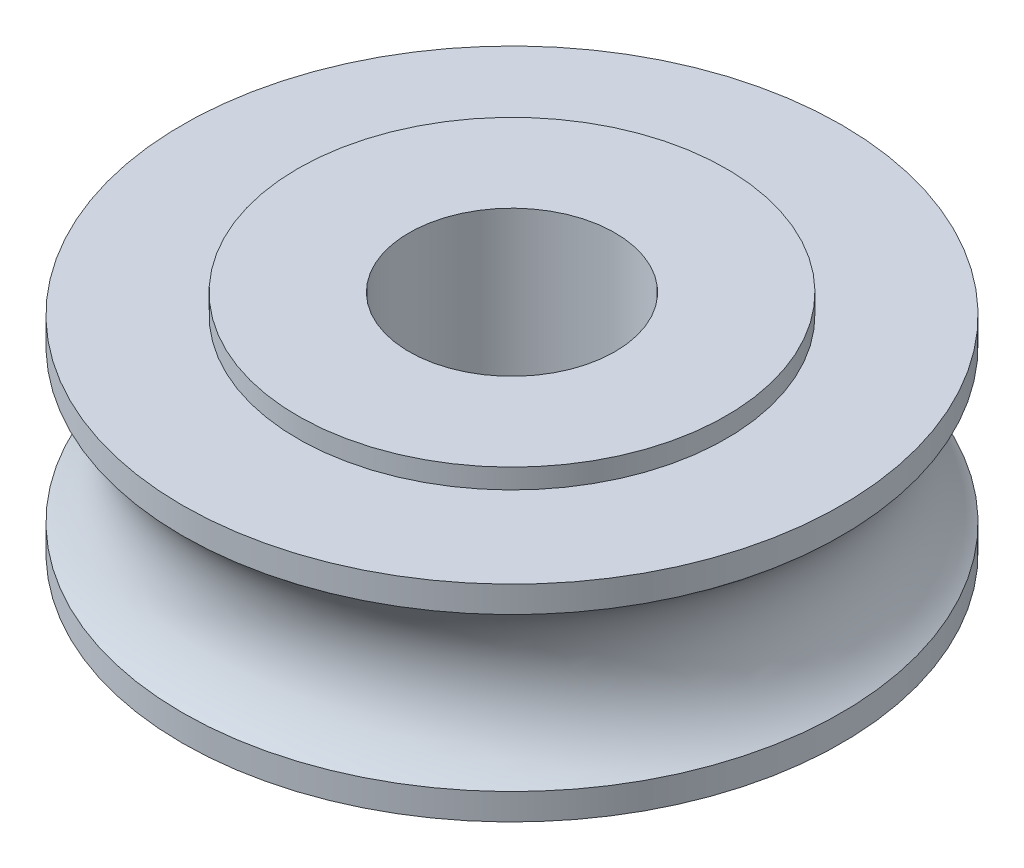
ISO-10303-21;
HEADER;
FILE_DESCRIPTION(('STEP AP214'),'2;1');
FILE_NAME('part.step','',(''),(''),'','','');
FILE_SCHEMA(('AUTOMOTIVE_DESIGN { 1 0 10303 214 1 1 1 1 }'));
ENDSEC;
DATA;
#1=APPLICATION_CONTEXT('core data for automotive mechanical design processes');
#2=APPLICATION_PROTOCOL_DEFINITION('international standard','automotive_design',2000,#1);
#3=PRODUCT_CONTEXT('',#1,'mechanical');
#4=PRODUCT('Part','Part','',(#3));
#5=PRODUCT_RELATED_PRODUCT_CATEGORY('part','',(#4));
#6=PRODUCT_DEFINITION_FORMATION('','',#4);
#7=PRODUCT_DEFINITION_CONTEXT('part definition',#1,'design');
#8=PRODUCT_DEFINITION('design','',#6,#7);
#9=PRODUCT_DEFINITION_SHAPE('','',#8);
#10=(LENGTH_UNIT() NAMED_UNIT(*) SI_UNIT(.MILLI.,.METRE.));
#11=(NAMED_UNIT(*) PLANE_ANGLE_UNIT() SI_UNIT($,.RADIAN.));
#12=(NAMED_UNIT(*) SI_UNIT($,.STERADIAN.) SOLID_ANGLE_UNIT());
#13=UNCERTAINTY_MEASURE_WITH_UNIT(LENGTH_MEASURE(1.E-05),#10,'distance_accuracy_value','');
#14=(GEOMETRIC_REPRESENTATION_CONTEXT(3) GLOBAL_UNCERTAINTY_ASSIGNED_CONTEXT((#13)) GLOBAL_UNIT_ASSIGNED_CONTEXT((#10,
#11,#12)) REPRESENTATION_CONTEXT('',''));
#15=CARTESIAN_POINT('',(0.,0.,0.));
#16=DIRECTION('',(0.,0.,1.));
#17=DIRECTION('',(1.,0.,0.));
#18=AXIS2_PLACEMENT_3D('',#15,#16,#17);
#19=CARTESIAN_POINT('',(0.,7.9375,0.));
#20=DIRECTION('',(0.,1.,0.));
#21=DIRECTION('',(0.,0.,1.));
#22=AXIS2_PLACEMENT_3D('',#19,#20,#21);
#23=PLANE('',#22);
#24=CARTESIAN_POINT('',(0.,7.9375,0.));
#25=DIRECTION('',(0.,1.,0.));
#26=DIRECTION('',(0.,0.,1.));
#27=AXIS2_PLACEMENT_3D('',#24,#25,#26);
#28=CIRCLE('',#27,12.7);
#29=CARTESIAN_POINT('',(0.,7.9375,12.7));
#30=VERTEX_POINT('',#29);
#31=EDGE_CURVE('E38',#30,#30,#28,.T.);
#32=ORIENTED_EDGE('',*,*,#31,.T.);
#33=EDGE_LOOP('',(#32));
#34=FACE_BOUND('',#33,.T.);
#35=CARTESIAN_POINT('',(0.,7.9375,0.));
#36=DIRECTION('',(0.,1.,0.));
#37=DIRECTION('',(0.,0.,1.));
#38=AXIS2_PLACEMENT_3D('',#35,#36,#37);
#39=CIRCLE('',#38,8.255);
#40=CARTESIAN_POINT('',(-8.25499999999994,7.9375,0.));
#41=VERTEX_POINT('',#40);
#42=EDGE_CURVE('E54',#41,#41,#39,.F.);
#43=ORIENTED_EDGE('',*,*,#42,.T.);
#44=EDGE_LOOP('',(#43));
#45=FACE_BOUND('',#44,.T.);
#46=ADVANCED_FACE('F31',(#34,#45),#23,.T.);
#47=CARTESIAN_POINT('',(0.,0.,0.));
#48=DIRECTION('',(0.,1.,0.));
#49=DIRECTION('',(0.,0.,1.));
#50=AXIS2_PLACEMENT_3D('',#47,#48,#49);
#51=PLANE('',#50);
#52=CARTESIAN_POINT('',(0.,0.,0.));
#53=DIRECTION('',(0.,1.,0.));
#54=DIRECTION('',(0.,0.,1.));
#55=AXIS2_PLACEMENT_3D('',#52,#53,#54);
#56=CIRCLE('',#55,12.7);
#57=CARTESIAN_POINT('',(0.,0.,12.7));
#58=VERTEX_POINT('',#57);
#59=EDGE_CURVE('E42',#58,#58,#56,.T.);
#60=ORIENTED_EDGE('',*,*,#59,.F.);
#61=EDGE_LOOP('',(#60));
#62=FACE_BOUND('',#61,.T.);
#63=CARTESIAN_POINT('',(0.,0.,0.));
#64=DIRECTION('',(0.,1.,0.));
#65=DIRECTION('',(0.,0.,1.));
#66=AXIS2_PLACEMENT_3D('',#63,#64,#65);
#67=CIRCLE('',#66,8.255);
#68=CARTESIAN_POINT('',(-8.255,0.,0.));
#69=VERTEX_POINT('',#68);
#70=EDGE_CURVE('E10',#69,#69,#67,.F.);
#71=ORIENTED_EDGE('',*,*,#70,.F.);
#72=EDGE_LOOP('',(#71));
#73=FACE_BOUND('',#72,.T.);
#74=ADVANCED_FACE('F90',(#62,#73),#51,.F.);
#75=CARTESIAN_POINT('',(0.,7.9375,0.));
#76=DIRECTION('',(0.,-1.,0.));
#77=DIRECTION('',(0.,0.,-1.));
#78=AXIS2_PLACEMENT_3D('',#75,#76,#77);
#79=CYLINDRICAL_SURFACE('',#78,12.7);
#80=CARTESIAN_POINT('',(0.,6.9215,0.));
#81=DIRECTION('',(0.,1.,0.));
#82=DIRECTION('',(0.,0.,1.));
#83=AXIS2_PLACEMENT_3D('',#80,#81,#82);
#84=CIRCLE('',#83,12.7);
#85=CARTESIAN_POINT('',(0.,6.9215,12.7));
#86=VERTEX_POINT('',#85);
#87=EDGE_CURVE('E51',#86,#86,#84,.T.);
#88=ORIENTED_EDGE('',*,*,#87,.T.);
#89=EDGE_LOOP('',(#88));
#90=FACE_BOUND('',#89,.T.);
#91=ORIENTED_EDGE('',*,*,#31,.F.);
#92=EDGE_LOOP('',(#91));
#93=FACE_BOUND('',#92,.T.);
#94=ADVANCED_FACE('F96',(#90,#93),#79,.T.);
#95=CARTESIAN_POINT('',(0.,1.016,0.));
#96=DIRECTION('',(0.,1.,0.));
#97=DIRECTION('',(0.,0.,1.));
#98=AXIS2_PLACEMENT_3D('',#95,#96,#97);
#99=CIRCLE('',#98,12.7);
#100=CARTESIAN_POINT('',(0.,1.016,12.7));
#101=VERTEX_POINT('',#100);
#102=EDGE_CURVE('E47',#101,#101,#99,.T.);
#103=ORIENTED_EDGE('',*,*,#102,.F.);
#104=EDGE_LOOP('',(#103));
#105=FACE_BOUND('',#104,.T.);
#106=ORIENTED_EDGE('',*,*,#59,.T.);
#107=EDGE_LOOP('',(#106));
#108=FACE_BOUND('',#107,.T.);
#109=ADVANCED_FACE('F33',(#105,#108),#79,.T.);
#110=CARTESIAN_POINT('',(0.,3.96875,0.));
#111=DIRECTION('',(0.,1.,0.));
#112=DIRECTION('',(0.,0.,1.));
#113=AXIS2_PLACEMENT_3D('',#110,#111,#112);
#114=TOROIDAL_SURFACE('',#113,14.9225136853448,3.69571368534483);
#115=ORIENTED_EDGE('',*,*,#87,.F.);
#116=EDGE_LOOP('',(#115));
#117=FACE_BOUND('',#116,.T.);
#118=ORIENTED_EDGE('',*,*,#102,.T.);
#119=EDGE_LOOP('',(#118));
#120=FACE_BOUND('',#119,.T.);
#121=ADVANCED_FACE('F84',(#117,#120),#114,.F.);
#122=CARTESIAN_POINT('',(0.,-0.825500000000002,0.));
#123=DIRECTION('',(0.,1.,0.));
#124=DIRECTION('',(-1.,0.,0.));
#125=AXIS2_PLACEMENT_3D('',#122,#123,#124);
#126=CYLINDRICAL_SURFACE('',#125,8.255);
#127=CARTESIAN_POINT('',(0.,-0.825500000000002,0.));
#128=DIRECTION('',(0.,-1.,0.));
#129=DIRECTION('',(1.,0.,0.));
#130=AXIS2_PLACEMENT_3D('',#127,#128,#129);
#131=CIRCLE('',#130,8.255);
#132=CARTESIAN_POINT('',(-8.25500000000001,-0.825499999999944,0.));
#133=VERTEX_POINT('',#132);
#134=EDGE_CURVE('E57',#133,#133,#131,.T.);
#135=CARTESIAN_POINT('',(-8.25500000000001,-0.825499999999944,0.));
#136=CARTESIAN_POINT('',(-8.25500000000001,-0.816901041666611,0.));
#137=CARTESIAN_POINT('',(-8.25500000000001,-0.808302083333279,0.));
#138=CARTESIAN_POINT('',(-8.25500000000001,-0.791104166666613,0.));
#139=CARTESIAN_POINT('',(-8.25500000000001,-0.78250520833328,0.));
#140=CARTESIAN_POINT('',(-8.25500000000001,-0.765307291666615,0.));
#141=CARTESIAN_POINT('',(-8.25500000000001,-0.756708333333282,0.));
#142=CARTESIAN_POINT('',(-8.25500000000001,-0.739510416666616,0.));
#143=CARTESIAN_POINT('',(-8.25500000000001,-0.730911458333284,0.));
#144=CARTESIAN_POINT('',(-8.25500000000001,-0.713713541666618,0.));
#145=CARTESIAN_POINT('',(-8.255,-0.705114583333285,0.));
#146=CARTESIAN_POINT('',(-8.255,-0.68791666666662,0.));
#147=CARTESIAN_POINT('',(-8.255,-0.679317708333287,0.));
#148=CARTESIAN_POINT('',(-8.255,-0.662119791666622,0.));
#149=CARTESIAN_POINT('',(-8.255,-0.653520833333289,0.));
#150=CARTESIAN_POINT('',(-8.255,-0.636322916666624,0.));
#151=CARTESIAN_POINT('',(-8.255,-0.627723958333291,0.));
#152=CARTESIAN_POINT('',(-8.255,-0.610526041666625,0.));
#153=CARTESIAN_POINT('',(-8.255,-0.601927083333293,0.));
#154=CARTESIAN_POINT('',(-8.255,-0.584729166666627,0.));
#155=CARTESIAN_POINT('',(-8.255,-0.576130208333294,0.));
#156=CARTESIAN_POINT('',(-8.255,-0.558932291666629,0.));
#157=CARTESIAN_POINT('',(-8.255,-0.550333333333296,0.));
#158=CARTESIAN_POINT('',(-8.255,-0.53313541666663,0.));
#159=CARTESIAN_POINT('',(-8.255,-0.524536458333298,0.));
#160=CARTESIAN_POINT('',(-8.255,-0.507338541666632,0.));
#161=CARTESIAN_POINT('',(-8.255,-0.4987395833333,0.));
#162=CARTESIAN_POINT('',(-8.255,-0.481541666666634,0.));
#163=CARTESIAN_POINT('',(-8.255,-0.472942708333301,0.));
#164=CARTESIAN_POINT('',(-8.255,-0.455744791666636,0.));
#165=CARTESIAN_POINT('',(-8.255,-0.447145833333303,0.));
#166=CARTESIAN_POINT('',(-8.255,-0.429947916666638,0.));
#167=CARTESIAN_POINT('',(-8.255,-0.421348958333305,0.));
#168=CARTESIAN_POINT('',(-8.255,-0.404151041666639,0.));
#169=CARTESIAN_POINT('',(-8.255,-0.395552083333306,0.));
#170=CARTESIAN_POINT('',(-8.255,-0.378354166666641,0.));
#171=CARTESIAN_POINT('',(-8.255,-0.369755208333308,0.));
#172=CARTESIAN_POINT('',(-8.255,-0.352557291666643,0.));
#173=CARTESIAN_POINT('',(-8.255,-0.34395833333331,0.));
#174=CARTESIAN_POINT('',(-8.255,-0.326760416666645,0.));
#175=CARTESIAN_POINT('',(-8.255,-0.318161458333312,0.));
#176=CARTESIAN_POINT('',(-8.255,-0.300963541666646,0.));
#177=CARTESIAN_POINT('',(-8.255,-0.292364583333314,0.));
#178=CARTESIAN_POINT('',(-8.255,-0.275166666666648,0.));
#179=CARTESIAN_POINT('',(-8.255,-0.266567708333315,0.));
#180=CARTESIAN_POINT('',(-8.255,-0.24936979166665,0.));
#181=CARTESIAN_POINT('',(-8.255,-0.240770833333317,0.));
#182=CARTESIAN_POINT('',(-8.255,-0.223572916666652,0.));
#183=CARTESIAN_POINT('',(-8.255,-0.214973958333319,0.));
#184=CARTESIAN_POINT('',(-8.255,-0.197776041666653,0.));
#185=CARTESIAN_POINT('',(-8.255,-0.189177083333321,0.));
#186=CARTESIAN_POINT('',(-8.255,-0.171979166666655,0.));
#187=CARTESIAN_POINT('',(-8.255,-0.163380208333322,0.));
#188=CARTESIAN_POINT('',(-8.255,-0.146182291666657,0.));
#189=CARTESIAN_POINT('',(-8.255,-0.137583333333324,0.));
#190=CARTESIAN_POINT('',(-8.255,-0.120385416666659,0.));
#191=CARTESIAN_POINT('',(-8.255,-0.111786458333326,0.));
#192=CARTESIAN_POINT('',(-8.255,-0.0945885416666604,0.));
#193=CARTESIAN_POINT('',(-8.255,-0.0859895833333276,0.));
#194=CARTESIAN_POINT('',(-8.255,-0.0687916666666621,0.));
#195=CARTESIAN_POINT('',(-8.255,-0.0601927083333294,0.));
#196=CARTESIAN_POINT('',(-8.255,-0.0429947916666639,0.));
#197=CARTESIAN_POINT('',(-8.255,-0.0343958333333311,0.));
#198=CARTESIAN_POINT('',(-8.255,-0.0171979166666656,0.));
#199=CARTESIAN_POINT('',(-8.255,-0.00859895833333286,0.));
#200=CARTESIAN_POINT('',(-8.255,0.,0.));
#201=B_SPLINE_CURVE_WITH_KNOTS('',3,(#135,#136,#137,#138,#139,#140,#141,#142,#143,#144,#145,
#146,#147,#148,#149,#150,#151,#152,#153,#154,#155,#156,#157,#158,#159,#160,#161,#162,#163,#164,
#165,#166,#167,#168,#169,#170,#171,#172,#173,#174,#175,#176,#177,#178,#179,#180,#181,#182,#183,
#184,#185,#186,#187,#188,#189,#190,#191,#192,#193,#194,#195,#196,#197,#198,#199,#200),
.UNSPECIFIED.,.F.,.F.,(4,2,2,2,2,2,2,2,2,2,2,2,2,2,2,2,2,2,2,2,2,2,2,2,2,2,2,2,2,2,2,2,4),(0.,
0.0257968749999983,0.0515937499999965,0.0773906249999948,0.103187499999993,0.128984374999991,
0.15478124999999,0.180578124999988,0.206374999999986,0.232171874999984,0.257968749999982,
0.283765624999981,0.309562499999979,0.335359374999977,0.361156249999975,0.386953124999974,
0.412749999999972,0.43854687499997,0.464343749999969,0.490140624999967,0.515937499999965,
0.541734374999963,0.567531249999961,0.59332812499996,0.619124999999958,0.644921874999956,
0.670718749999954,0.696515624999953,0.722312499999951,0.748109374999949,0.773906249999947,
0.799703124999946,0.825499999999944),.UNSPECIFIED.);
#202=EDGE_CURVE('BSEAM75',#133,#69,#201,.T.);
#203=ORIENTED_EDGE('',*,*,#134,.F.);
#204=ORIENTED_EDGE('',*,*,#70,.T.);
#205=ORIENTED_EDGE('',*,*,#202,.T.);
#206=ORIENTED_EDGE('',*,*,#202,.F.);
#207=EDGE_LOOP('',(#203,#205,#204,#206));
#208=FACE_BOUND('',#207,.T.);
#209=ADVANCED_FACE('F75',(#208),#126,.T.);
#210=CARTESIAN_POINT('',(0.,-0.825500000000002,0.));
#211=DIRECTION('',(0.,-1.,0.));
#212=DIRECTION('',(1.,0.,0.));
#213=AXIS2_PLACEMENT_3D('',#210,#211,#212);
#214=PLANE('',#213);
#215=ORIENTED_EDGE('',*,*,#134,.T.);
#216=EDGE_LOOP('',(#215));
#217=FACE_BOUND('',#216,.T.);
#218=CARTESIAN_POINT('',(0.,-0.825500000000002,0.));
#219=DIRECTION('',(0.,-1.,0.));
#220=DIRECTION('',(1.,0.,0.));
#221=AXIS2_PLACEMENT_3D('',#218,#219,#220);
#222=CIRCLE('',#221,3.96875);
#223=CARTESIAN_POINT('',(3.96874999999999,-0.825500000000029,0.));
#224=VERTEX_POINT('',#223);
#225=EDGE_CURVE('E61',#224,#224,#222,.T.);
#226=ORIENTED_EDGE('',*,*,#225,.F.);
#227=EDGE_LOOP('',(#226));
#228=FACE_BOUND('',#227,.T.);
#229=ADVANCED_FACE('F73',(#217,#228),#214,.T.);
#230=CARTESIAN_POINT('',(0.,0.,0.));
#231=DIRECTION('',(0.,1.,0.));
#232=DIRECTION('',(0.,0.,1.));
#233=AXIS2_PLACEMENT_3D('',#230,#231,#232);
#234=CYLINDRICAL_SURFACE('',#233,3.96875);
#235=ORIENTED_EDGE('',*,*,#225,.T.);
#236=EDGE_LOOP('',(#235));
#237=FACE_BOUND('',#236,.T.);
#238=CARTESIAN_POINT('',(0.,8.6995,0.));
#239=DIRECTION('',(0.,-1.,0.));
#240=DIRECTION('',(1.,0.,0.));
#241=AXIS2_PLACEMENT_3D('',#238,#239,#240);
#242=CIRCLE('',#241,3.96875);
#243=CARTESIAN_POINT('',(3.96875000000006,8.69949999999997,0.));
#244=VERTEX_POINT('',#243);
#245=EDGE_CURVE('E64',#244,#244,#242,.T.);
#246=ORIENTED_EDGE('',*,*,#245,.F.);
#247=EDGE_LOOP('',(#246));
#248=FACE_BOUND('',#247,.T.);
#249=ADVANCED_FACE('F70',(#237,#248),#234,.F.);
#250=CARTESIAN_POINT('',(0.,8.6995,0.));
#251=DIRECTION('',(0.,-1.,0.));
#252=DIRECTION('',(1.,0.,0.));
#253=AXIS2_PLACEMENT_3D('',#250,#251,#252);
#254=PLANE('',#253);
#255=CARTESIAN_POINT('',(0.,8.6995,0.));
#256=DIRECTION('',(0.,-1.,0.));
#257=DIRECTION('',(1.,0.,0.));
#258=AXIS2_PLACEMENT_3D('',#255,#256,#257);
#259=CIRCLE('',#258,8.255);
#260=CARTESIAN_POINT('',(-8.25499999999994,8.69950000000006,0.));
#261=VERTEX_POINT('',#260);
#262=EDGE_CURVE('E58',#261,#261,#259,.T.);
#263=ORIENTED_EDGE('',*,*,#262,.F.);
#264=EDGE_LOOP('',(#263));
#265=FACE_BOUND('',#264,.T.);
#266=ORIENTED_EDGE('',*,*,#245,.T.);
#267=EDGE_LOOP('',(#266));
#268=FACE_BOUND('',#267,.T.);
#269=ADVANCED_FACE('F82',(#265,#268),#254,.F.);
#270=CARTESIAN_POINT('',(-8.25499999999994,7.9375,0.));
#271=CARTESIAN_POINT('',(-8.25499999999994,7.9454375,0.));
#272=CARTESIAN_POINT('',(-8.25499999999994,7.953375,0.));
#273=CARTESIAN_POINT('',(-8.25499999999994,7.96925,0.));
#274=CARTESIAN_POINT('',(-8.25499999999994,7.9771875,0.));
#275=CARTESIAN_POINT('',(-8.25499999999994,7.9930625,0.));
#276=CARTESIAN_POINT('',(-8.25499999999994,8.001,0.));
#277=CARTESIAN_POINT('',(-8.25499999999994,8.016875,0.));
#278=CARTESIAN_POINT('',(-8.25499999999994,8.0248125,0.));
#279=CARTESIAN_POINT('',(-8.25499999999994,8.04068750000001,0.));
#280=CARTESIAN_POINT('',(-8.25499999999994,8.04862500000001,0.));
#281=CARTESIAN_POINT('',(-8.25499999999994,8.06450000000001,0.));
#282=CARTESIAN_POINT('',(-8.25499999999994,8.07243750000001,0.));
#283=CARTESIAN_POINT('',(-8.25499999999994,8.08831250000001,0.));
#284=CARTESIAN_POINT('',(-8.25499999999994,8.09625000000001,0.));
#285=CARTESIAN_POINT('',(-8.25499999999994,8.11212500000001,0.));
#286=CARTESIAN_POINT('',(-8.25499999999994,8.12006250000001,0.));
#287=CARTESIAN_POINT('',(-8.25499999999994,8.13593750000001,0.));
#288=CARTESIAN_POINT('',(-8.25499999999994,8.14387500000001,0.));
#289=CARTESIAN_POINT('',(-8.25499999999994,8.15975000000002,0.));
#290=CARTESIAN_POINT('',(-8.25499999999994,8.16768750000002,0.));
#291=CARTESIAN_POINT('',(-8.25499999999994,8.18356250000002,0.));
#292=CARTESIAN_POINT('',(-8.25499999999994,8.19150000000002,0.));
#293=CARTESIAN_POINT('',(-8.25499999999994,8.20737500000002,0.));
#294=CARTESIAN_POINT('',(-8.25499999999994,8.21531250000002,0.));
#295=CARTESIAN_POINT('',(-8.25499999999994,8.23118750000002,0.));
#296=CARTESIAN_POINT('',(-8.25499999999994,8.23912500000002,0.));
#297=CARTESIAN_POINT('',(-8.25499999999994,8.25500000000002,0.));
#298=CARTESIAN_POINT('',(-8.25499999999994,8.26293750000002,0.));
#299=CARTESIAN_POINT('',(-8.25499999999994,8.27881250000002,0.));
#300=CARTESIAN_POINT('',(-8.25499999999994,8.28675000000002,0.));
#301=CARTESIAN_POINT('',(-8.25499999999994,8.30262500000003,0.));
#302=CARTESIAN_POINT('',(-8.25499999999994,8.31056250000003,0.));
#303=CARTESIAN_POINT('',(-8.25499999999994,8.32643750000003,0.));
#304=CARTESIAN_POINT('',(-8.25499999999994,8.33437500000003,0.));
#305=CARTESIAN_POINT('',(-8.25499999999994,8.35025000000003,0.));
#306=CARTESIAN_POINT('',(-8.25499999999994,8.35818750000003,0.));
#307=CARTESIAN_POINT('',(-8.25499999999994,8.37406250000003,0.));
#308=CARTESIAN_POINT('',(-8.25499999999994,8.38200000000003,0.));
#309=CARTESIAN_POINT('',(-8.25499999999994,8.39787500000003,0.));
#310=CARTESIAN_POINT('',(-8.25499999999994,8.40581250000003,0.));
#311=CARTESIAN_POINT('',(-8.25499999999994,8.42168750000003,0.));
#312=CARTESIAN_POINT('',(-8.25499999999994,8.42962500000004,0.));
#313=CARTESIAN_POINT('',(-8.25499999999994,8.44550000000004,0.));
#314=CARTESIAN_POINT('',(-8.25499999999994,8.45343750000004,0.));
#315=CARTESIAN_POINT('',(-8.25499999999994,8.46931250000004,0.));
#316=CARTESIAN_POINT('',(-8.25499999999994,8.47725000000004,0.));
#317=CARTESIAN_POINT('',(-8.25499999999994,8.49312500000004,0.));
#318=CARTESIAN_POINT('',(-8.25499999999994,8.50106250000004,0.));
#319=CARTESIAN_POINT('',(-8.25499999999994,8.51693750000004,0.));
#320=CARTESIAN_POINT('',(-8.25499999999994,8.52487500000004,0.));
#321=CARTESIAN_POINT('',(-8.25499999999994,8.54075000000005,0.));
#322=CARTESIAN_POINT('',(-8.25499999999994,8.54868750000004,0.));
#323=CARTESIAN_POINT('',(-8.25499999999994,8.56456250000005,0.));
#324=CARTESIAN_POINT('',(-8.25499999999994,8.57250000000005,0.));
#325=CARTESIAN_POINT('',(-8.25499999999994,8.58837500000005,0.));
#326=CARTESIAN_POINT('',(-8.25499999999994,8.59631250000005,0.));
#327=CARTESIAN_POINT('',(-8.25499999999994,8.61218750000005,0.));
#328=CARTESIAN_POINT('',(-8.25499999999994,8.62012500000005,0.));
#329=CARTESIAN_POINT('',(-8.25499999999994,8.63600000000005,0.));
#330=CARTESIAN_POINT('',(-8.25499999999994,8.64393750000005,0.));
#331=CARTESIAN_POINT('',(-8.25499999999994,8.65981250000005,0.));
#332=CARTESIAN_POINT('',(-8.25499999999994,8.66775000000005,0.));
#333=CARTESIAN_POINT('',(-8.25499999999994,8.68362500000006,0.));
#334=CARTESIAN_POINT('',(-8.25499999999994,8.69156250000005,0.));
#335=CARTESIAN_POINT('',(-8.25499999999994,8.69950000000006,0.));
#336=B_SPLINE_CURVE_WITH_KNOTS('',3,(#270,#271,#272,#273,#274,#275,#276,#277,#278,#279,#280,
#281,#282,#283,#284,#285,#286,#287,#288,#289,#290,#291,#292,#293,#294,#295,#296,#297,#298,#299,
#300,#301,#302,#303,#304,#305,#306,#307,#308,#309,#310,#311,#312,#313,#314,#315,#316,#317,#318,
#319,#320,#321,#322,#323,#324,#325,#326,#327,#328,#329,#330,#331,#332,#333,#334,#335),
.UNSPECIFIED.,.F.,.F.,(4,2,2,2,2,2,2,2,2,2,2,2,2,2,2,2,2,2,2,2,2,2,2,2,2,2,2,2,2,2,2,2,4),(0.,
0.0238125000000013,0.0476250000000043,0.0714375000000055,0.0952500000000068,0.11906250000001,
0.142875000000011,0.166687500000012,0.190500000000014,0.214312500000017,0.238125000000018,
0.261937500000019,0.285750000000022,0.309562500000023,0.333375000000025,0.357187500000028,
0.381000000000029,0.40481250000003,0.428625000000033,0.452437500000034,0.476250000000036,
0.500062500000039,0.52387500000004,0.547687500000041,0.571500000000044,0.595312500000045,
0.619125000000047,0.642937500000048,0.666750000000051,0.690562500000052,0.714375000000053,
0.738187500000057,0.762000000000058),.UNSPECIFIED.);
#337=EDGE_CURVE('BSEAM87',#41,#261,#336,.T.);
#338=ORIENTED_EDGE('',*,*,#42,.F.);
#339=ORIENTED_EDGE('',*,*,#262,.T.);
#340=ORIENTED_EDGE('',*,*,#337,.T.);
#341=ORIENTED_EDGE('',*,*,#337,.F.);
#342=EDGE_LOOP('',(#338,#340,#339,#341));
#343=FACE_BOUND('',#342,.T.);
#344=ADVANCED_FACE('F87',(#343),#126,.T.);
#345=CLOSED_SHELL('',(#46,#74,#94,#109,#121,#209,#229,#249,#269,#344));
#346=MANIFOLD_SOLID_BREP('B2',#345);
#347=ADVANCED_BREP_SHAPE_REPRESENTATION('',(#18,#346),#14);
#348=SHAPE_DEFINITION_REPRESENTATION(#9,#347);
ENDSEC;
END-ISO-10303-21;
